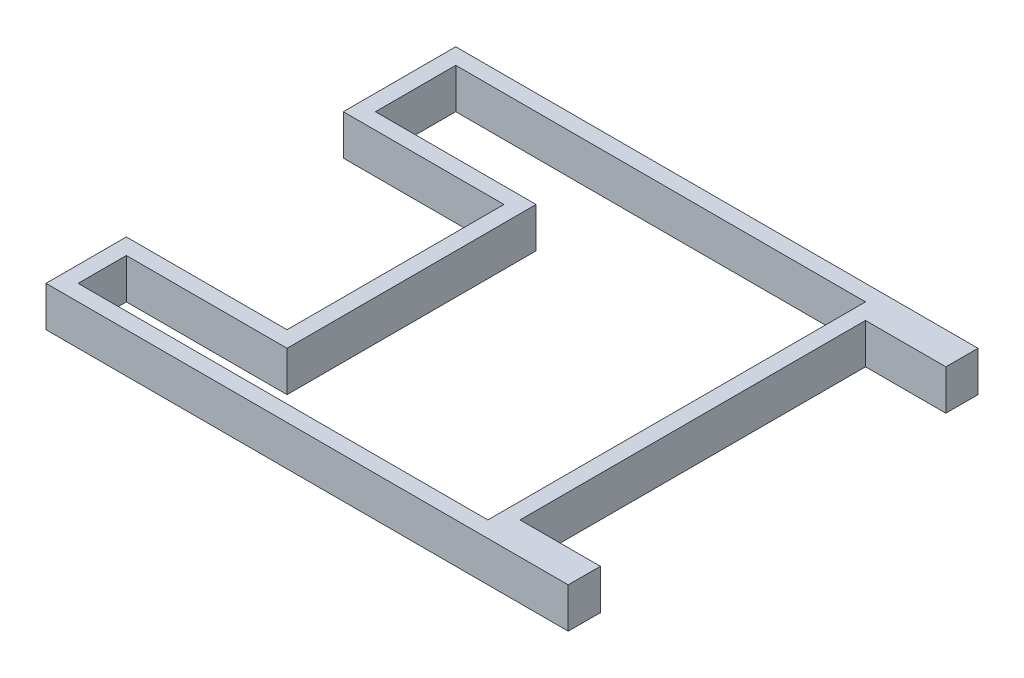
ISO-10303-21;
HEADER;
FILE_DESCRIPTION(('STEP AP214'),'2;1');
FILE_NAME('part.step','',(''),(''),'','','');
FILE_SCHEMA(('AUTOMOTIVE_DESIGN { 1 0 10303 214 1 1 1 1 }'));
ENDSEC;
DATA;
#1=APPLICATION_CONTEXT('core data for automotive mechanical design processes');
#2=APPLICATION_PROTOCOL_DEFINITION('international standard','automotive_design',2000,#1);
#3=PRODUCT_CONTEXT('',#1,'mechanical');
#4=PRODUCT('Part','Part','',(#3));
#5=PRODUCT_RELATED_PRODUCT_CATEGORY('part','',(#4));
#6=PRODUCT_DEFINITION_FORMATION('','',#4);
#7=PRODUCT_DEFINITION_CONTEXT('part definition',#1,'design');
#8=PRODUCT_DEFINITION('design','',#6,#7);
#9=PRODUCT_DEFINITION_SHAPE('','',#8);
#10=(LENGTH_UNIT() NAMED_UNIT(*) SI_UNIT(.MILLI.,.METRE.));
#11=(NAMED_UNIT(*) PLANE_ANGLE_UNIT() SI_UNIT($,.RADIAN.));
#12=(NAMED_UNIT(*) SI_UNIT($,.STERADIAN.) SOLID_ANGLE_UNIT());
#13=UNCERTAINTY_MEASURE_WITH_UNIT(LENGTH_MEASURE(1.E-05),#10,'distance_accuracy_value','');
#14=(GEOMETRIC_REPRESENTATION_CONTEXT(3) GLOBAL_UNCERTAINTY_ASSIGNED_CONTEXT((#13)) GLOBAL_UNIT_ASSIGNED_CONTEXT((#10,
#11,#12)) REPRESENTATION_CONTEXT('',''));
#15=CARTESIAN_POINT('',(0.,0.,0.));
#16=DIRECTION('',(0.,0.,1.));
#17=DIRECTION('',(1.,0.,0.));
#18=AXIS2_PLACEMENT_3D('',#15,#16,#17);
#19=CARTESIAN_POINT('',(0.,5.,0.));
#20=DIRECTION('',(0.,1.,0.));
#21=DIRECTION('',(0.,0.,1.));
#22=AXIS2_PLACEMENT_3D('',#19,#20,#21);
#23=PLANE('',#22);
#24=DIRECTION('',(0.,0.,1.));
#25=VECTOR('',#24,1.);
#26=CARTESIAN_POINT('',(-44.7750722139343,5.,-21.1463963963964));
#27=LINE('',#26,#25);
#28=CARTESIAN_POINT('',(-44.7750722139343,5.,-21.1463963963964));
#29=VERTEX_POINT('',#28);
#30=CARTESIAN_POINT('',(-44.7750722139343,5.,-7.14639639639635));
#31=VERTEX_POINT('',#30);
#32=EDGE_CURVE('E266',#29,#31,#27,.T.);
#33=ORIENTED_EDGE('',*,*,#32,.T.);
#34=DIRECTION('',(1.,0.,0.));
#35=VECTOR('',#34,1.);
#36=CARTESIAN_POINT('',(-44.7750722139343,5.,-7.14639639639635));
#37=LINE('',#36,#35);
#38=CARTESIAN_POINT('',(-24.7750722139343,5.,-7.14639639639636));
#39=VERTEX_POINT('',#38);
#40=EDGE_CURVE('E270',#31,#39,#37,.T.);
#41=ORIENTED_EDGE('',*,*,#40,.T.);
#42=DIRECTION('',(0.,0.,1.));
#43=VECTOR('',#42,1.);
#44=CARTESIAN_POINT('',(-24.7750722139343,5.,-7.14639639639636));
#45=LINE('',#44,#43);
#46=CARTESIAN_POINT('',(-24.7750722139343,5.,19.8536036036036));
#47=VERTEX_POINT('',#46);
#48=EDGE_CURVE('E274',#39,#47,#45,.T.);
#49=ORIENTED_EDGE('',*,*,#48,.T.);
#50=DIRECTION('',(-1.,0.,0.));
#51=VECTOR('',#50,1.);
#52=CARTESIAN_POINT('',(-24.7750722139343,5.,19.8536036036036));
#53=LINE('',#52,#51);
#54=CARTESIAN_POINT('',(-44.7750722139343,5.,19.8536036036037));
#55=VERTEX_POINT('',#54);
#56=EDGE_CURVE('E277',#47,#55,#53,.T.);
#57=ORIENTED_EDGE('',*,*,#56,.T.);
#58=DIRECTION('',(0.,0.,1.));
#59=VECTOR('',#58,1.);
#60=CARTESIAN_POINT('',(-44.7750722139343,5.,19.8536036036037));
#61=LINE('',#60,#59);
#62=CARTESIAN_POINT('',(-44.7750722139343,5.,29.8536036036037));
#63=VERTEX_POINT('',#62);
#64=EDGE_CURVE('E280',#55,#63,#61,.T.);
#65=ORIENTED_EDGE('',*,*,#64,.T.);
#66=DIRECTION('',(1.,0.,0.));
#67=VECTOR('',#66,1.);
#68=CARTESIAN_POINT('',(-44.7750722139343,5.,29.8536036036037));
#69=LINE('',#68,#67);
#70=CARTESIAN_POINT('',(20.2249277860657,5.,29.8536036036036));
#71=VERTEX_POINT('',#70);
#72=EDGE_CURVE('E283',#63,#71,#69,.T.);
#73=ORIENTED_EDGE('',*,*,#72,.T.);
#74=DIRECTION('',(0.,0.,-1.));
#75=VECTOR('',#74,1.);
#76=CARTESIAN_POINT('',(20.2249277860657,5.,25.8536036036036));
#77=LINE('',#76,#75);
#78=CARTESIAN_POINT('',(20.2249277860657,5.,25.8536036036036));
#79=VERTEX_POINT('',#78);
#80=EDGE_CURVE('E286',#71,#79,#77,.T.);
#81=ORIENTED_EDGE('',*,*,#80,.T.);
#82=DIRECTION('',(-1.,0.,0.));
#83=VECTOR('',#82,1.);
#84=CARTESIAN_POINT('',(10.2249277860657,5.,25.8536036036036));
#85=LINE('',#84,#83);
#86=CARTESIAN_POINT('',(10.2249277860657,5.,25.8536036036036));
#87=VERTEX_POINT('',#86);
#88=EDGE_CURVE('E289',#79,#87,#85,.T.);
#89=ORIENTED_EDGE('',*,*,#88,.T.);
#90=DIRECTION('',(0.,0.,-1.));
#91=VECTOR('',#90,1.);
#92=CARTESIAN_POINT('',(10.2249277860657,5.,-17.1463963963964));
#93=LINE('',#92,#91);
#94=CARTESIAN_POINT('',(10.2249277860657,5.,-17.1463963963964));
#95=VERTEX_POINT('',#94);
#96=EDGE_CURVE('E292',#87,#95,#93,.T.);
#97=ORIENTED_EDGE('',*,*,#96,.T.);
#98=DIRECTION('',(1.,0.,0.));
#99=VECTOR('',#98,1.);
#100=CARTESIAN_POINT('',(20.2249277860657,5.,-17.1463963963964));
#101=LINE('',#100,#99);
#102=CARTESIAN_POINT('',(20.2249277860657,5.,-17.1463963963964));
#103=VERTEX_POINT('',#102);
#104=EDGE_CURVE('E295',#95,#103,#101,.T.);
#105=ORIENTED_EDGE('',*,*,#104,.T.);
#106=DIRECTION('',(0.,0.,-1.));
#107=VECTOR('',#106,1.);
#108=CARTESIAN_POINT('',(20.2249277860657,5.,-21.1463963963964));
#109=LINE('',#108,#107);
#110=CARTESIAN_POINT('',(20.2249277860657,5.,-21.1463963963964));
#111=VERTEX_POINT('',#110);
#112=EDGE_CURVE('E298',#103,#111,#109,.T.);
#113=ORIENTED_EDGE('',*,*,#112,.T.);
#114=DIRECTION('',(-1.,0.,0.));
#115=VECTOR('',#114,1.);
#116=CARTESIAN_POINT('',(-44.7750722139343,5.,-21.1463963963964));
#117=LINE('',#116,#115);
#118=EDGE_CURVE('E301',#111,#29,#117,.T.);
#119=ORIENTED_EDGE('',*,*,#118,.T.);
#120=EDGE_LOOP('',(#33,#41,#49,#57,#65,#73,#81,#89,#97,#105,#113,#119));
#121=FACE_BOUND('',#120,.T.);
#122=DIRECTION('',(1.,0.,0.));
#123=VECTOR('',#122,1.);
#124=CARTESIAN_POINT('',(-22.7750722139343,5.,-9.14639639639636));
#125=LINE('',#124,#123);
#126=CARTESIAN_POINT('',(-42.7750722139343,5.,-9.14639639639636));
#127=VERTEX_POINT('',#126);
#128=CARTESIAN_POINT('',(-22.7750722139343,5.,-9.14639639639636));
#129=VERTEX_POINT('',#128);
#130=EDGE_CURVE('E186',#127,#129,#125,.T.);
#131=ORIENTED_EDGE('',*,*,#130,.F.);
#132=DIRECTION('',(0.,0.,1.));
#133=VECTOR('',#132,1.);
#134=CARTESIAN_POINT('',(-42.7750722139343,5.,-9.14639639639636));
#135=LINE('',#134,#133);
#136=CARTESIAN_POINT('',(-42.7750722139343,5.,-19.1463963963964));
#137=VERTEX_POINT('',#136);
#138=EDGE_CURVE('E177',#137,#127,#135,.T.);
#139=ORIENTED_EDGE('',*,*,#138,.F.);
#140=DIRECTION('',(-1.,0.,0.));
#141=VECTOR('',#140,1.);
#142=CARTESIAN_POINT('',(-42.7750722139343,5.,-19.1463963963964));
#143=LINE('',#142,#141);
#144=CARTESIAN_POINT('',(8.22492778606567,5.,-19.1463963963964));
#145=VERTEX_POINT('',#144);
#146=EDGE_CURVE('E218',#145,#137,#143,.T.);
#147=ORIENTED_EDGE('',*,*,#146,.F.);
#148=DIRECTION('',(0.,0.,-1.));
#149=VECTOR('',#148,1.);
#150=CARTESIAN_POINT('',(8.22492778606567,5.,-19.1463963963964));
#151=LINE('',#150,#149);
#152=CARTESIAN_POINT('',(8.22492778606568,5.,27.8536036036036));
#153=VERTEX_POINT('',#152);
#154=EDGE_CURVE('E215',#153,#145,#151,.T.);
#155=ORIENTED_EDGE('',*,*,#154,.F.);
#156=DIRECTION('',(1.,0.,0.));
#157=VECTOR('',#156,1.);
#158=CARTESIAN_POINT('',(8.22492778606568,5.,27.8536036036036));
#159=LINE('',#158,#157);
#160=CARTESIAN_POINT('',(-42.7750722139343,5.,27.8536036036036));
#161=VERTEX_POINT('',#160);
#162=EDGE_CURVE('E212',#161,#153,#159,.T.);
#163=ORIENTED_EDGE('',*,*,#162,.F.);
#164=DIRECTION('',(0.,0.,1.));
#165=VECTOR('',#164,1.);
#166=CARTESIAN_POINT('',(-42.7750722139343,5.,27.8536036036036));
#167=LINE('',#166,#165);
#168=CARTESIAN_POINT('',(-42.7750722139343,5.,21.8536036036037));
#169=VERTEX_POINT('',#168);
#170=EDGE_CURVE('E209',#169,#161,#167,.T.);
#171=ORIENTED_EDGE('',*,*,#170,.F.);
#172=DIRECTION('',(-1.,0.,0.));
#173=VECTOR('',#172,1.);
#174=CARTESIAN_POINT('',(-42.7750722139343,5.,21.8536036036037));
#175=LINE('',#174,#173);
#176=CARTESIAN_POINT('',(-22.7750722139343,5.,21.8536036036037));
#177=VERTEX_POINT('',#176);
#178=EDGE_CURVE('E204',#177,#169,#175,.T.);
#179=ORIENTED_EDGE('',*,*,#178,.F.);
#180=DIRECTION('',(0.,0.,1.));
#181=VECTOR('',#180,1.);
#182=CARTESIAN_POINT('',(-22.7750722139343,5.,21.8536036036037));
#183=LINE('',#182,#181);
#184=EDGE_CURVE('E200',#129,#177,#183,.T.);
#185=ORIENTED_EDGE('',*,*,#184,.F.);
#186=EDGE_LOOP('',(#131,#139,#147,#155,#163,#171,#179,#185));
#187=FACE_BOUND('',#186,.T.);
#188=ADVANCED_FACE('F39',(#121,#187),#23,.T.);
#189=CARTESIAN_POINT('',(0.,0.,0.));
#190=DIRECTION('',(0.,1.,0.));
#191=DIRECTION('',(0.,0.,1.));
#192=AXIS2_PLACEMENT_3D('',#189,#190,#191);
#193=PLANE('',#192);
#194=DIRECTION('',(0.,0.,1.));
#195=VECTOR('',#194,1.);
#196=CARTESIAN_POINT('',(-44.7750722139343,0.,-21.1463963963964));
#197=LINE('',#196,#195);
#198=CARTESIAN_POINT('',(-44.7750722139343,0.,-21.1463963963964));
#199=VERTEX_POINT('',#198);
#200=CARTESIAN_POINT('',(-44.7750722139343,0.,-7.14639639639635));
#201=VERTEX_POINT('',#200);
#202=EDGE_CURVE('E195',#199,#201,#197,.T.);
#203=ORIENTED_EDGE('',*,*,#202,.F.);
#204=DIRECTION('',(-1.,0.,0.));
#205=VECTOR('',#204,1.);
#206=CARTESIAN_POINT('',(-44.7750722139343,0.,-21.1463963963964));
#207=LINE('',#206,#205);
#208=CARTESIAN_POINT('',(20.2249277860657,0.,-21.1463963963964));
#209=VERTEX_POINT('',#208);
#210=EDGE_CURVE('E271',#209,#199,#207,.T.);
#211=ORIENTED_EDGE('',*,*,#210,.F.);
#212=DIRECTION('',(0.,0.,-1.));
#213=VECTOR('',#212,1.);
#214=CARTESIAN_POINT('',(20.2249277860657,0.,-21.1463963963964));
#215=LINE('',#214,#213);
#216=CARTESIAN_POINT('',(20.2249277860657,0.,-17.1463963963964));
#217=VERTEX_POINT('',#216);
#218=EDGE_CURVE('E335',#217,#209,#215,.T.);
#219=ORIENTED_EDGE('',*,*,#218,.F.);
#220=DIRECTION('',(1.,0.,0.));
#221=VECTOR('',#220,1.);
#222=CARTESIAN_POINT('',(20.2249277860657,0.,-17.1463963963964));
#223=LINE('',#222,#221);
#224=CARTESIAN_POINT('',(10.2249277860657,0.,-17.1463963963964));
#225=VERTEX_POINT('',#224);
#226=EDGE_CURVE('E332',#225,#217,#223,.T.);
#227=ORIENTED_EDGE('',*,*,#226,.F.);
#228=DIRECTION('',(0.,0.,-1.));
#229=VECTOR('',#228,1.);
#230=CARTESIAN_POINT('',(10.2249277860657,0.,-17.1463963963964));
#231=LINE('',#230,#229);
#232=CARTESIAN_POINT('',(10.2249277860657,0.,25.8536036036036));
#233=VERTEX_POINT('',#232);
#234=EDGE_CURVE('E329',#233,#225,#231,.T.);
#235=ORIENTED_EDGE('',*,*,#234,.F.);
#236=DIRECTION('',(-1.,0.,0.));
#237=VECTOR('',#236,1.);
#238=CARTESIAN_POINT('',(10.2249277860657,0.,25.8536036036036));
#239=LINE('',#238,#237);
#240=CARTESIAN_POINT('',(20.2249277860657,0.,25.8536036036036));
#241=VERTEX_POINT('',#240);
#242=EDGE_CURVE('E326',#241,#233,#239,.T.);
#243=ORIENTED_EDGE('',*,*,#242,.F.);
#244=DIRECTION('',(0.,0.,-1.));
#245=VECTOR('',#244,1.);
#246=CARTESIAN_POINT('',(20.2249277860657,0.,25.8536036036036));
#247=LINE('',#246,#245);
#248=CARTESIAN_POINT('',(20.2249277860657,0.,29.8536036036036));
#249=VERTEX_POINT('',#248);
#250=EDGE_CURVE('E323',#249,#241,#247,.T.);
#251=ORIENTED_EDGE('',*,*,#250,.F.);
#252=DIRECTION('',(1.,0.,0.));
#253=VECTOR('',#252,1.);
#254=CARTESIAN_POINT('',(-44.7750722139343,0.,29.8536036036037));
#255=LINE('',#254,#253);
#256=CARTESIAN_POINT('',(-44.7750722139343,0.,29.8536036036037));
#257=VERTEX_POINT('',#256);
#258=EDGE_CURVE('E320',#257,#249,#255,.T.);
#259=ORIENTED_EDGE('',*,*,#258,.F.);
#260=DIRECTION('',(0.,0.,1.));
#261=VECTOR('',#260,1.);
#262=CARTESIAN_POINT('',(-44.7750722139343,0.,19.8536036036037));
#263=LINE('',#262,#261);
#264=CARTESIAN_POINT('',(-44.7750722139343,0.,19.8536036036037));
#265=VERTEX_POINT('',#264);
#266=EDGE_CURVE('E317',#265,#257,#263,.T.);
#267=ORIENTED_EDGE('',*,*,#266,.F.);
#268=DIRECTION('',(-1.,0.,0.));
#269=VECTOR('',#268,1.);
#270=CARTESIAN_POINT('',(-24.7750722139343,0.,19.8536036036036));
#271=LINE('',#270,#269);
#272=CARTESIAN_POINT('',(-24.7750722139343,0.,19.8536036036036));
#273=VERTEX_POINT('',#272);
#274=EDGE_CURVE('E314',#273,#265,#271,.T.);
#275=ORIENTED_EDGE('',*,*,#274,.F.);
#276=DIRECTION('',(0.,0.,1.));
#277=VECTOR('',#276,1.);
#278=CARTESIAN_POINT('',(-24.7750722139343,0.,-7.14639639639636));
#279=LINE('',#278,#277);
#280=CARTESIAN_POINT('',(-24.7750722139343,0.,-7.14639639639636));
#281=VERTEX_POINT('',#280);
#282=EDGE_CURVE('E311',#281,#273,#279,.T.);
#283=ORIENTED_EDGE('',*,*,#282,.F.);
#284=DIRECTION('',(1.,0.,0.));
#285=VECTOR('',#284,1.);
#286=CARTESIAN_POINT('',(-44.7750722139343,0.,-7.14639639639635));
#287=LINE('',#286,#285);
#288=EDGE_CURVE('E308',#201,#281,#287,.T.);
#289=ORIENTED_EDGE('',*,*,#288,.F.);
#290=EDGE_LOOP('',(#203,#211,#219,#227,#235,#243,#251,#259,#267,#275,#283,#289));
#291=FACE_BOUND('',#290,.T.);
#292=DIRECTION('',(0.,0.,1.));
#293=VECTOR('',#292,1.);
#294=CARTESIAN_POINT('',(-42.7750722139343,0.,-9.14639639639636));
#295=LINE('',#294,#293);
#296=CARTESIAN_POINT('',(-42.7750722139343,0.,-19.1463963963964));
#297=VERTEX_POINT('',#296);
#298=CARTESIAN_POINT('',(-42.7750722139343,0.,-9.14639639639636));
#299=VERTEX_POINT('',#298);
#300=EDGE_CURVE('E63',#297,#299,#295,.T.);
#301=ORIENTED_EDGE('',*,*,#300,.T.);
#302=DIRECTION('',(1.,0.,0.));
#303=VECTOR('',#302,1.);
#304=CARTESIAN_POINT('',(-22.7750722139343,0.,-9.14639639639636));
#305=LINE('',#304,#303);
#306=CARTESIAN_POINT('',(-22.7750722139343,0.,-9.14639639639636));
#307=VERTEX_POINT('',#306);
#308=EDGE_CURVE('E193',#299,#307,#305,.T.);
#309=ORIENTED_EDGE('',*,*,#308,.T.);
#310=DIRECTION('',(0.,0.,1.));
#311=VECTOR('',#310,1.);
#312=CARTESIAN_POINT('',(-22.7750722139343,0.,21.8536036036037));
#313=LINE('',#312,#311);
#314=CARTESIAN_POINT('',(-22.7750722139343,0.,21.8536036036037));
#315=VERTEX_POINT('',#314);
#316=EDGE_CURVE('E225',#307,#315,#313,.T.);
#317=ORIENTED_EDGE('',*,*,#316,.T.);
#318=DIRECTION('',(-1.,0.,0.));
#319=VECTOR('',#318,1.);
#320=CARTESIAN_POINT('',(-42.7750722139343,0.,21.8536036036037));
#321=LINE('',#320,#319);
#322=CARTESIAN_POINT('',(-42.7750722139343,0.,21.8536036036037));
#323=VERTEX_POINT('',#322);
#324=EDGE_CURVE('E229',#315,#323,#321,.T.);
#325=ORIENTED_EDGE('',*,*,#324,.T.);
#326=DIRECTION('',(0.,0.,1.));
#327=VECTOR('',#326,1.);
#328=CARTESIAN_POINT('',(-42.7750722139343,0.,27.8536036036036));
#329=LINE('',#328,#327);
#330=CARTESIAN_POINT('',(-42.7750722139343,0.,27.8536036036036));
#331=VERTEX_POINT('',#330);
#332=EDGE_CURVE('E233',#323,#331,#329,.T.);
#333=ORIENTED_EDGE('',*,*,#332,.T.);
#334=DIRECTION('',(1.,0.,0.));
#335=VECTOR('',#334,1.);
#336=CARTESIAN_POINT('',(8.22492778606568,0.,27.8536036036036));
#337=LINE('',#336,#335);
#338=CARTESIAN_POINT('',(8.22492778606568,0.,27.8536036036036));
#339=VERTEX_POINT('',#338);
#340=EDGE_CURVE('E237',#331,#339,#337,.T.);
#341=ORIENTED_EDGE('',*,*,#340,.T.);
#342=DIRECTION('',(0.,0.,-1.));
#343=VECTOR('',#342,1.);
#344=CARTESIAN_POINT('',(8.22492778606567,0.,-19.1463963963964));
#345=LINE('',#344,#343);
#346=CARTESIAN_POINT('',(8.22492778606567,0.,-19.1463963963964));
#347=VERTEX_POINT('',#346);
#348=EDGE_CURVE('E241',#339,#347,#345,.T.);
#349=ORIENTED_EDGE('',*,*,#348,.T.);
#350=DIRECTION('',(-1.,0.,0.));
#351=VECTOR('',#350,1.);
#352=CARTESIAN_POINT('',(-42.7750722139343,0.,-19.1463963963964));
#353=LINE('',#352,#351);
#354=EDGE_CURVE('E187',#347,#297,#353,.T.);
#355=ORIENTED_EDGE('',*,*,#354,.T.);
#356=EDGE_LOOP('',(#301,#309,#317,#325,#333,#341,#349,#355));
#357=FACE_BOUND('',#356,.T.);
#358=ADVANCED_FACE('F390',(#291,#357),#193,.F.);
#359=CARTESIAN_POINT('',(-44.7750722139343,5.,-21.1463963963964));
#360=DIRECTION('',(1.,0.,0.));
#361=DIRECTION('',(0.,0.,-1.));
#362=AXIS2_PLACEMENT_3D('',#359,#360,#361);
#363=PLANE('',#362);
#364=ORIENTED_EDGE('',*,*,#202,.T.);
#365=DIRECTION('',(0.,-1.,0.));
#366=VECTOR('',#365,1.);
#367=CARTESIAN_POINT('',(-44.7750722139343,5.,-7.14639639639635));
#368=LINE('',#367,#366);
#369=EDGE_CURVE('E11',#31,#201,#368,.T.);
#370=ORIENTED_EDGE('',*,*,#369,.F.);
#371=ORIENTED_EDGE('',*,*,#32,.F.);
#372=DIRECTION('',(0.,-1.,0.));
#373=VECTOR('',#372,1.);
#374=CARTESIAN_POINT('',(-44.7750722139343,5.,-21.1463963963964));
#375=LINE('',#374,#373);
#376=EDGE_CURVE('E304',#29,#199,#375,.T.);
#377=ORIENTED_EDGE('',*,*,#376,.T.);
#378=EDGE_LOOP('',(#364,#370,#371,#377));
#379=FACE_BOUND('',#378,.T.);
#380=ADVANCED_FACE('F41',(#379),#363,.F.);
#381=CARTESIAN_POINT('',(-44.7750722139343,5.,-7.14639639639635));
#382=DIRECTION('',(0.,0.,-1.));
#383=DIRECTION('',(-1.,0.,0.));
#384=AXIS2_PLACEMENT_3D('',#381,#382,#383);
#385=PLANE('',#384);
#386=ORIENTED_EDGE('',*,*,#288,.T.);
#387=DIRECTION('',(0.,-1.,0.));
#388=VECTOR('',#387,1.);
#389=CARTESIAN_POINT('',(-24.7750722139343,5.,-7.14639639639636));
#390=LINE('',#389,#388);
#391=EDGE_CURVE('E48',#39,#281,#390,.T.);
#392=ORIENTED_EDGE('',*,*,#391,.F.);
#393=ORIENTED_EDGE('',*,*,#40,.F.);
#394=ORIENTED_EDGE('',*,*,#369,.T.);
#395=EDGE_LOOP('',(#386,#392,#393,#394));
#396=FACE_BOUND('',#395,.T.);
#397=ADVANCED_FACE('F407',(#396),#385,.F.);
#398=CARTESIAN_POINT('',(-24.7750722139343,5.,-7.14639639639636));
#399=DIRECTION('',(1.,0.,0.));
#400=DIRECTION('',(0.,0.,-1.));
#401=AXIS2_PLACEMENT_3D('',#398,#399,#400);
#402=PLANE('',#401);
#403=ORIENTED_EDGE('',*,*,#282,.T.);
#404=DIRECTION('',(0.,-1.,0.));
#405=VECTOR('',#404,1.);
#406=CARTESIAN_POINT('',(-24.7750722139343,5.,19.8536036036036));
#407=LINE('',#406,#405);
#408=EDGE_CURVE('E375',#47,#273,#407,.T.);
#409=ORIENTED_EDGE('',*,*,#408,.F.);
#410=ORIENTED_EDGE('',*,*,#48,.F.);
#411=ORIENTED_EDGE('',*,*,#391,.T.);
#412=EDGE_LOOP('',(#403,#409,#410,#411));
#413=FACE_BOUND('',#412,.T.);
#414=ADVANCED_FACE('F384',(#413),#402,.F.);
#415=CARTESIAN_POINT('',(-24.7750722139343,5.,19.8536036036036));
#416=DIRECTION('',(0.,0.,1.));
#417=DIRECTION('',(1.,0.,0.));
#418=AXIS2_PLACEMENT_3D('',#415,#416,#417);
#419=PLANE('',#418);
#420=ORIENTED_EDGE('',*,*,#274,.T.);
#421=DIRECTION('',(0.,-1.,0.));
#422=VECTOR('',#421,1.);
#423=CARTESIAN_POINT('',(-44.7750722139343,5.,19.8536036036037));
#424=LINE('',#423,#422);
#425=EDGE_CURVE('E371',#55,#265,#424,.T.);
#426=ORIENTED_EDGE('',*,*,#425,.F.);
#427=ORIENTED_EDGE('',*,*,#56,.F.);
#428=ORIENTED_EDGE('',*,*,#408,.T.);
#429=EDGE_LOOP('',(#420,#426,#427,#428));
#430=FACE_BOUND('',#429,.T.);
#431=ADVANCED_FACE('F396',(#430),#419,.F.);
#432=CARTESIAN_POINT('',(-44.7750722139343,5.,19.8536036036037));
#433=DIRECTION('',(1.,0.,0.));
#434=DIRECTION('',(0.,0.,-1.));
#435=AXIS2_PLACEMENT_3D('',#432,#433,#434);
#436=PLANE('',#435);
#437=ORIENTED_EDGE('',*,*,#266,.T.);
#438=DIRECTION('',(0.,-1.,0.));
#439=VECTOR('',#438,1.);
#440=CARTESIAN_POINT('',(-44.7750722139343,5.,29.8536036036037));
#441=LINE('',#440,#439);
#442=EDGE_CURVE('E367',#63,#257,#441,.T.);
#443=ORIENTED_EDGE('',*,*,#442,.F.);
#444=ORIENTED_EDGE('',*,*,#64,.F.);
#445=ORIENTED_EDGE('',*,*,#425,.T.);
#446=EDGE_LOOP('',(#437,#443,#444,#445));
#447=FACE_BOUND('',#446,.T.);
#448=ADVANCED_FACE('F400',(#447),#436,.F.);
#449=CARTESIAN_POINT('',(-44.7750722139343,5.,29.8536036036037));
#450=DIRECTION('',(0.,0.,-1.));
#451=DIRECTION('',(-1.,0.,0.));
#452=AXIS2_PLACEMENT_3D('',#449,#450,#451);
#453=PLANE('',#452);
#454=ORIENTED_EDGE('',*,*,#258,.T.);
#455=DIRECTION('',(0.,-1.,0.));
#456=VECTOR('',#455,1.);
#457=CARTESIAN_POINT('',(20.2249277860657,5.,29.8536036036036));
#458=LINE('',#457,#456);
#459=EDGE_CURVE('E363',#71,#249,#458,.T.);
#460=ORIENTED_EDGE('',*,*,#459,.F.);
#461=ORIENTED_EDGE('',*,*,#72,.F.);
#462=ORIENTED_EDGE('',*,*,#442,.T.);
#463=EDGE_LOOP('',(#454,#460,#461,#462));
#464=FACE_BOUND('',#463,.T.);
#465=ADVANCED_FACE('F440',(#464),#453,.F.);
#466=CARTESIAN_POINT('',(20.2249277860657,5.,25.8536036036036));
#467=DIRECTION('',(-1.,0.,0.));
#468=DIRECTION('',(0.,0.,1.));
#469=AXIS2_PLACEMENT_3D('',#466,#467,#468);
#470=PLANE('',#469);
#471=ORIENTED_EDGE('',*,*,#250,.T.);
#472=DIRECTION('',(0.,-1.,0.));
#473=VECTOR('',#472,1.);
#474=CARTESIAN_POINT('',(20.2249277860657,5.,25.8536036036036));
#475=LINE('',#474,#473);
#476=EDGE_CURVE('E359',#79,#241,#475,.T.);
#477=ORIENTED_EDGE('',*,*,#476,.F.);
#478=ORIENTED_EDGE('',*,*,#80,.F.);
#479=ORIENTED_EDGE('',*,*,#459,.T.);
#480=EDGE_LOOP('',(#471,#477,#478,#479));
#481=FACE_BOUND('',#480,.T.);
#482=ADVANCED_FACE('F438',(#481),#470,.F.);
#483=CARTESIAN_POINT('',(10.2249277860657,5.,25.8536036036036));
#484=DIRECTION('',(0.,0.,1.));
#485=DIRECTION('',(1.,0.,0.));
#486=AXIS2_PLACEMENT_3D('',#483,#484,#485);
#487=PLANE('',#486);
#488=ORIENTED_EDGE('',*,*,#242,.T.);
#489=DIRECTION('',(0.,-1.,0.));
#490=VECTOR('',#489,1.);
#491=CARTESIAN_POINT('',(10.2249277860657,5.,25.8536036036036));
#492=LINE('',#491,#490);
#493=EDGE_CURVE('E355',#87,#233,#492,.T.);
#494=ORIENTED_EDGE('',*,*,#493,.F.);
#495=ORIENTED_EDGE('',*,*,#88,.F.);
#496=ORIENTED_EDGE('',*,*,#476,.T.);
#497=EDGE_LOOP('',(#488,#494,#495,#496));
#498=FACE_BOUND('',#497,.T.);
#499=ADVANCED_FACE('F434',(#498),#487,.F.);
#500=CARTESIAN_POINT('',(10.2249277860657,5.,-17.1463963963964));
#501=DIRECTION('',(-1.,0.,0.));
#502=DIRECTION('',(0.,0.,1.));
#503=AXIS2_PLACEMENT_3D('',#500,#501,#502);
#504=PLANE('',#503);
#505=ORIENTED_EDGE('',*,*,#234,.T.);
#506=DIRECTION('',(0.,-1.,0.));
#507=VECTOR('',#506,1.);
#508=CARTESIAN_POINT('',(10.2249277860657,5.,-17.1463963963964));
#509=LINE('',#508,#507);
#510=EDGE_CURVE('E351',#95,#225,#509,.T.);
#511=ORIENTED_EDGE('',*,*,#510,.F.);
#512=ORIENTED_EDGE('',*,*,#96,.F.);
#513=ORIENTED_EDGE('',*,*,#493,.T.);
#514=EDGE_LOOP('',(#505,#511,#512,#513));
#515=FACE_BOUND('',#514,.T.);
#516=ADVANCED_FACE('F429',(#515),#504,.F.);
#517=CARTESIAN_POINT('',(20.2249277860657,5.,-17.1463963963964));
#518=DIRECTION('',(0.,0.,-1.));
#519=DIRECTION('',(-1.,0.,0.));
#520=AXIS2_PLACEMENT_3D('',#517,#518,#519);
#521=PLANE('',#520);
#522=ORIENTED_EDGE('',*,*,#226,.T.);
#523=DIRECTION('',(0.,-1.,0.));
#524=VECTOR('',#523,1.);
#525=CARTESIAN_POINT('',(20.2249277860657,5.,-17.1463963963964));
#526=LINE('',#525,#524);
#527=EDGE_CURVE('E347',#103,#217,#526,.T.);
#528=ORIENTED_EDGE('',*,*,#527,.F.);
#529=ORIENTED_EDGE('',*,*,#104,.F.);
#530=ORIENTED_EDGE('',*,*,#510,.T.);
#531=EDGE_LOOP('',(#522,#528,#529,#530));
#532=FACE_BOUND('',#531,.T.);
#533=ADVANCED_FACE('F423',(#532),#521,.F.);
#534=CARTESIAN_POINT('',(20.2249277860657,5.,-21.1463963963964));
#535=DIRECTION('',(-1.,0.,0.));
#536=DIRECTION('',(0.,0.,1.));
#537=AXIS2_PLACEMENT_3D('',#534,#535,#536);
#538=PLANE('',#537);
#539=ORIENTED_EDGE('',*,*,#218,.T.);
#540=DIRECTION('',(0.,-1.,0.));
#541=VECTOR('',#540,1.);
#542=CARTESIAN_POINT('',(20.2249277860657,5.,-21.1463963963964));
#543=LINE('',#542,#541);
#544=EDGE_CURVE('E343',#111,#209,#543,.T.);
#545=ORIENTED_EDGE('',*,*,#544,.F.);
#546=ORIENTED_EDGE('',*,*,#112,.F.);
#547=ORIENTED_EDGE('',*,*,#527,.T.);
#548=EDGE_LOOP('',(#539,#545,#546,#547));
#549=FACE_BOUND('',#548,.T.);
#550=ADVANCED_FACE('F419',(#549),#538,.F.);
#551=CARTESIAN_POINT('',(-44.7750722139343,5.,-21.1463963963964));
#552=DIRECTION('',(0.,0.,1.));
#553=DIRECTION('',(1.,0.,0.));
#554=AXIS2_PLACEMENT_3D('',#551,#552,#553);
#555=PLANE('',#554);
#556=ORIENTED_EDGE('',*,*,#210,.T.);
#557=ORIENTED_EDGE('',*,*,#376,.F.);
#558=ORIENTED_EDGE('',*,*,#118,.F.);
#559=ORIENTED_EDGE('',*,*,#544,.T.);
#560=EDGE_LOOP('',(#556,#557,#558,#559));
#561=FACE_BOUND('',#560,.T.);
#562=ADVANCED_FACE('F414',(#561),#555,.F.);
#563=CARTESIAN_POINT('',(-42.7750722139343,5.,-9.14639639639636));
#564=DIRECTION('',(1.,0.,0.));
#565=DIRECTION('',(0.,0.,-1.));
#566=AXIS2_PLACEMENT_3D('',#563,#564,#565);
#567=PLANE('',#566);
#568=ORIENTED_EDGE('',*,*,#300,.F.);
#569=DIRECTION('',(0.,-1.,0.));
#570=VECTOR('',#569,1.);
#571=CARTESIAN_POINT('',(-42.7750722139343,5.,-19.1463963963964));
#572=LINE('',#571,#570);
#573=EDGE_CURVE('E181',#137,#297,#572,.T.);
#574=ORIENTED_EDGE('',*,*,#573,.F.);
#575=ORIENTED_EDGE('',*,*,#138,.T.);
#576=DIRECTION('',(0.,-1.,0.));
#577=VECTOR('',#576,1.);
#578=CARTESIAN_POINT('',(-42.7750722139343,5.,-9.14639639639636));
#579=LINE('',#578,#577);
#580=EDGE_CURVE('E180',#127,#299,#579,.T.);
#581=ORIENTED_EDGE('',*,*,#580,.T.);
#582=EDGE_LOOP('',(#568,#574,#575,#581));
#583=FACE_BOUND('',#582,.T.);
#584=ADVANCED_FACE('F179',(#583),#567,.T.);
#585=CARTESIAN_POINT('',(-22.7750722139343,5.,-9.14639639639636));
#586=DIRECTION('',(0.,0.,-1.));
#587=DIRECTION('',(-1.,0.,0.));
#588=AXIS2_PLACEMENT_3D('',#585,#586,#587);
#589=PLANE('',#588);
#590=ORIENTED_EDGE('',*,*,#308,.F.);
#591=ORIENTED_EDGE('',*,*,#580,.F.);
#592=ORIENTED_EDGE('',*,*,#130,.T.);
#593=DIRECTION('',(0.,-1.,0.));
#594=VECTOR('',#593,1.);
#595=CARTESIAN_POINT('',(-22.7750722139343,5.,-9.14639639639636));
#596=LINE('',#595,#594);
#597=EDGE_CURVE('E196',#129,#307,#596,.T.);
#598=ORIENTED_EDGE('',*,*,#597,.T.);
#599=EDGE_LOOP('',(#590,#591,#592,#598));
#600=FACE_BOUND('',#599,.T.);
#601=ADVANCED_FACE('F190',(#600),#589,.T.);
#602=CARTESIAN_POINT('',(-22.7750722139343,5.,21.8536036036037));
#603=DIRECTION('',(1.,0.,0.));
#604=DIRECTION('',(0.,0.,-1.));
#605=AXIS2_PLACEMENT_3D('',#602,#603,#604);
#606=PLANE('',#605);
#607=ORIENTED_EDGE('',*,*,#316,.F.);
#608=ORIENTED_EDGE('',*,*,#597,.F.);
#609=ORIENTED_EDGE('',*,*,#184,.T.);
#610=DIRECTION('',(0.,-1.,0.));
#611=VECTOR('',#610,1.);
#612=CARTESIAN_POINT('',(-22.7750722139343,5.,21.8536036036037));
#613=LINE('',#612,#611);
#614=EDGE_CURVE('E261',#177,#315,#613,.T.);
#615=ORIENTED_EDGE('',*,*,#614,.T.);
#616=EDGE_LOOP('',(#607,#608,#609,#615));
#617=FACE_BOUND('',#616,.T.);
#618=ADVANCED_FACE('F498',(#617),#606,.T.);
#619=CARTESIAN_POINT('',(-42.7750722139343,5.,21.8536036036037));
#620=DIRECTION('',(0.,0.,1.));
#621=DIRECTION('',(1.,0.,0.));
#622=AXIS2_PLACEMENT_3D('',#619,#620,#621);
#623=PLANE('',#622);
#624=ORIENTED_EDGE('',*,*,#324,.F.);
#625=ORIENTED_EDGE('',*,*,#614,.F.);
#626=ORIENTED_EDGE('',*,*,#178,.T.);
#627=DIRECTION('',(0.,-1.,0.));
#628=VECTOR('',#627,1.);
#629=CARTESIAN_POINT('',(-42.7750722139343,5.,21.8536036036037));
#630=LINE('',#629,#628);
#631=EDGE_CURVE('E258',#169,#323,#630,.T.);
#632=ORIENTED_EDGE('',*,*,#631,.T.);
#633=EDGE_LOOP('',(#624,#625,#626,#632));
#634=FACE_BOUND('',#633,.T.);
#635=ADVANCED_FACE('F504',(#634),#623,.T.);
#636=CARTESIAN_POINT('',(-42.7750722139343,5.,27.8536036036036));
#637=DIRECTION('',(1.,0.,0.));
#638=DIRECTION('',(0.,0.,-1.));
#639=AXIS2_PLACEMENT_3D('',#636,#637,#638);
#640=PLANE('',#639);
#641=ORIENTED_EDGE('',*,*,#332,.F.);
#642=ORIENTED_EDGE('',*,*,#631,.F.);
#643=ORIENTED_EDGE('',*,*,#170,.T.);
#644=DIRECTION('',(0.,-1.,0.));
#645=VECTOR('',#644,1.);
#646=CARTESIAN_POINT('',(-42.7750722139343,5.,27.8536036036036));
#647=LINE('',#646,#645);
#648=EDGE_CURVE('E255',#161,#331,#647,.T.);
#649=ORIENTED_EDGE('',*,*,#648,.T.);
#650=EDGE_LOOP('',(#641,#642,#643,#649));
#651=FACE_BOUND('',#650,.T.);
#652=ADVANCED_FACE('F512',(#651),#640,.T.);
#653=CARTESIAN_POINT('',(8.22492778606568,5.,27.8536036036036));
#654=DIRECTION('',(0.,0.,-1.));
#655=DIRECTION('',(-1.,0.,0.));
#656=AXIS2_PLACEMENT_3D('',#653,#654,#655);
#657=PLANE('',#656);
#658=ORIENTED_EDGE('',*,*,#340,.F.);
#659=ORIENTED_EDGE('',*,*,#648,.F.);
#660=ORIENTED_EDGE('',*,*,#162,.T.);
#661=DIRECTION('',(0.,-1.,0.));
#662=VECTOR('',#661,1.);
#663=CARTESIAN_POINT('',(8.22492778606568,5.,27.8536036036036));
#664=LINE('',#663,#662);
#665=EDGE_CURVE('E252',#153,#339,#664,.T.);
#666=ORIENTED_EDGE('',*,*,#665,.T.);
#667=EDGE_LOOP('',(#658,#659,#660,#666));
#668=FACE_BOUND('',#667,.T.);
#669=ADVANCED_FACE('F520',(#668),#657,.T.);
#670=CARTESIAN_POINT('',(8.22492778606567,5.,-19.1463963963964));
#671=DIRECTION('',(-1.,0.,0.));
#672=DIRECTION('',(0.,0.,1.));
#673=AXIS2_PLACEMENT_3D('',#670,#671,#672);
#674=PLANE('',#673);
#675=ORIENTED_EDGE('',*,*,#348,.F.);
#676=ORIENTED_EDGE('',*,*,#665,.F.);
#677=ORIENTED_EDGE('',*,*,#154,.T.);
#678=DIRECTION('',(0.,-1.,0.));
#679=VECTOR('',#678,1.);
#680=CARTESIAN_POINT('',(8.22492778606567,5.,-19.1463963963964));
#681=LINE('',#680,#679);
#682=EDGE_CURVE('E55',#145,#347,#681,.T.);
#683=ORIENTED_EDGE('',*,*,#682,.T.);
#684=EDGE_LOOP('',(#675,#676,#677,#683));
#685=FACE_BOUND('',#684,.T.);
#686=ADVANCED_FACE('F528',(#685),#674,.T.);
#687=CARTESIAN_POINT('',(-42.7750722139343,5.,-19.1463963963964));
#688=DIRECTION('',(0.,0.,1.));
#689=DIRECTION('',(1.,0.,0.));
#690=AXIS2_PLACEMENT_3D('',#687,#688,#689);
#691=PLANE('',#690);
#692=ORIENTED_EDGE('',*,*,#354,.F.);
#693=ORIENTED_EDGE('',*,*,#682,.F.);
#694=ORIENTED_EDGE('',*,*,#146,.T.);
#695=ORIENTED_EDGE('',*,*,#573,.T.);
#696=EDGE_LOOP('',(#692,#693,#694,#695));
#697=FACE_BOUND('',#696,.T.);
#698=ADVANCED_FACE('F536',(#697),#691,.T.);
#699=CLOSED_SHELL('',(#188,#358,#380,#397,#414,#431,#448,#465,#482,#499,#516,#533,#550,#562,
#584,#601,#618,#635,#652,#669,#686,#698));
#700=MANIFOLD_SOLID_BREP('B2',#699);
#701=ADVANCED_BREP_SHAPE_REPRESENTATION('',(#18,#700),#14);
#702=SHAPE_DEFINITION_REPRESENTATION(#9,#701);
ENDSEC;
END-ISO-10303-21;
